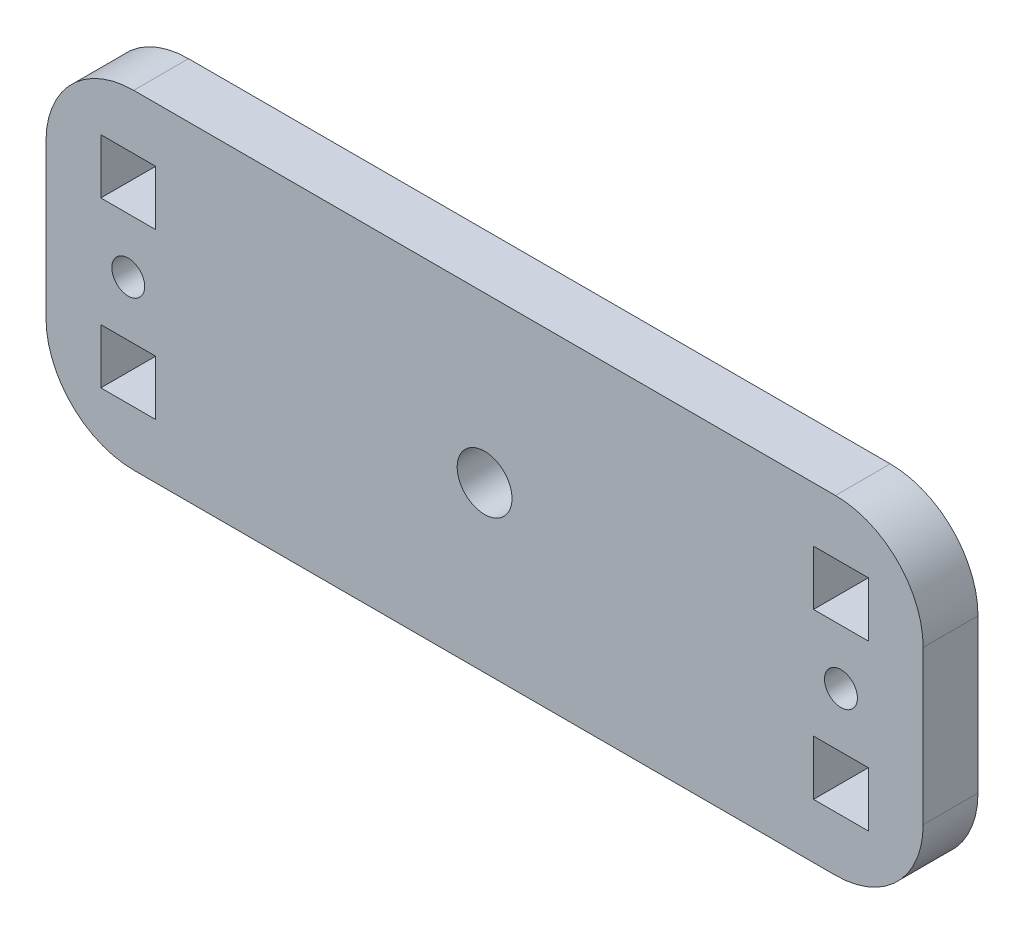
ISO-10303-21;
HEADER;
FILE_DESCRIPTION(('STEP AP214'),'2;1');
FILE_NAME('part.step','',(''),(''),'','','');
FILE_SCHEMA(('AUTOMOTIVE_DESIGN { 1 0 10303 214 1 1 1 1 }'));
ENDSEC;
DATA;
#1=APPLICATION_CONTEXT('core data for automotive mechanical design processes');
#2=APPLICATION_PROTOCOL_DEFINITION('international standard','automotive_design',2000,#1);
#3=PRODUCT_CONTEXT('',#1,'mechanical');
#4=PRODUCT('Part','Part','',(#3));
#5=PRODUCT_RELATED_PRODUCT_CATEGORY('part','',(#4));
#6=PRODUCT_DEFINITION_FORMATION('','',#4);
#7=PRODUCT_DEFINITION_CONTEXT('part definition',#1,'design');
#8=PRODUCT_DEFINITION('design','',#6,#7);
#9=PRODUCT_DEFINITION_SHAPE('','',#8);
#10=(LENGTH_UNIT() NAMED_UNIT(*) SI_UNIT(.MILLI.,.METRE.));
#11=(NAMED_UNIT(*) PLANE_ANGLE_UNIT() SI_UNIT($,.RADIAN.));
#12=(NAMED_UNIT(*) SI_UNIT($,.STERADIAN.) SOLID_ANGLE_UNIT());
#13=UNCERTAINTY_MEASURE_WITH_UNIT(LENGTH_MEASURE(1.E-05),#10,'distance_accuracy_value','');
#14=(GEOMETRIC_REPRESENTATION_CONTEXT(3) GLOBAL_UNCERTAINTY_ASSIGNED_CONTEXT((#13)) GLOBAL_UNIT_ASSIGNED_CONTEXT((#10,
#11,#12)) REPRESENTATION_CONTEXT('',''));
#15=CARTESIAN_POINT('',(0.,0.,0.));
#16=DIRECTION('',(0.,0.,1.));
#17=DIRECTION('',(1.,0.,0.));
#18=AXIS2_PLACEMENT_3D('',#15,#16,#17);
#19=CARTESIAN_POINT('',(8.,8.,5.));
#20=DIRECTION('',(0.,0.,-1.));
#21=DIRECTION('',(-1.,0.,0.));
#22=AXIS2_PLACEMENT_3D('',#19,#20,#21);
#23=PLANE('',#22);
#24=DIRECTION('',(1.,0.,0.));
#25=VECTOR('',#24,1.);
#26=CARTESIAN_POINT('',(70.,4.99999999999998,5.));
#27=LINE('',#26,#25);
#28=CARTESIAN_POINT('',(70.,4.99999999999998,5.));
#29=VERTEX_POINT('',#28);
#30=CARTESIAN_POINT('',(75.,4.99999999999998,5.));
#31=VERTEX_POINT('',#30);
#32=EDGE_CURVE('E233',#29,#31,#27,.T.);
#33=ORIENTED_EDGE('',*,*,#32,.F.);
#34=DIRECTION('',(0.,-1.,0.));
#35=VECTOR('',#34,1.);
#36=CARTESIAN_POINT('',(70.,4.99999999999998,5.));
#37=LINE('',#36,#35);
#38=CARTESIAN_POINT('',(70.,10.,5.));
#39=VERTEX_POINT('',#38);
#40=EDGE_CURVE('E241',#39,#29,#37,.T.);
#41=ORIENTED_EDGE('',*,*,#40,.F.);
#42=DIRECTION('',(-1.,0.,0.));
#43=VECTOR('',#42,1.);
#44=CARTESIAN_POINT('',(70.,10.,5.));
#45=LINE('',#44,#43);
#46=CARTESIAN_POINT('',(75.,10.,5.));
#47=VERTEX_POINT('',#46);
#48=EDGE_CURVE('E238',#47,#39,#45,.T.);
#49=ORIENTED_EDGE('',*,*,#48,.F.);
#50=DIRECTION('',(0.,1.,0.));
#51=VECTOR('',#50,1.);
#52=CARTESIAN_POINT('',(75.,4.99999999999998,5.));
#53=LINE('',#52,#51);
#54=EDGE_CURVE('E235',#31,#47,#53,.T.);
#55=ORIENTED_EDGE('',*,*,#54,.F.);
#56=EDGE_LOOP('',(#33,#41,#49,#55));
#57=FACE_BOUND('',#56,.T.);
#58=CARTESIAN_POINT('',(7.5,15.,5.));
#59=DIRECTION('',(0.,0.,1.));
#60=DIRECTION('',(1.,0.,0.));
#61=AXIS2_PLACEMENT_3D('',#58,#59,#60);
#62=CIRCLE('',#61,1.5);
#63=CARTESIAN_POINT('',(9.,15.,5.));
#64=VERTEX_POINT('',#63);
#65=EDGE_CURVE('E301',#64,#64,#62,.T.);
#66=ORIENTED_EDGE('',*,*,#65,.F.);
#67=EDGE_LOOP('',(#66));
#68=FACE_BOUND('',#67,.T.);
#69=DIRECTION('',(0.,-1.,0.));
#70=VECTOR('',#69,1.);
#71=CARTESIAN_POINT('',(5.,25.,5.));
#72=LINE('',#71,#70);
#73=CARTESIAN_POINT('',(5.,25.,5.));
#74=VERTEX_POINT('',#73);
#75=CARTESIAN_POINT('',(5.,20.,5.));
#76=VERTEX_POINT('',#75);
#77=EDGE_CURVE('E307',#74,#76,#72,.T.);
#78=ORIENTED_EDGE('',*,*,#77,.F.);
#79=DIRECTION('',(-1.,0.,0.));
#80=VECTOR('',#79,1.);
#81=CARTESIAN_POINT('',(5.,25.,5.));
#82=LINE('',#81,#80);
#83=CARTESIAN_POINT('',(10.,25.,5.));
#84=VERTEX_POINT('',#83);
#85=EDGE_CURVE('E315',#84,#74,#82,.T.);
#86=ORIENTED_EDGE('',*,*,#85,.F.);
#87=DIRECTION('',(0.,1.,0.));
#88=VECTOR('',#87,1.);
#89=CARTESIAN_POINT('',(10.,25.,5.));
#90=LINE('',#89,#88);
#91=CARTESIAN_POINT('',(10.,20.,5.));
#92=VERTEX_POINT('',#91);
#93=EDGE_CURVE('E312',#92,#84,#90,.T.);
#94=ORIENTED_EDGE('',*,*,#93,.F.);
#95=DIRECTION('',(1.,0.,0.));
#96=VECTOR('',#95,1.);
#97=CARTESIAN_POINT('',(5.,20.,5.));
#98=LINE('',#97,#96);
#99=EDGE_CURVE('E309',#76,#92,#98,.T.);
#100=ORIENTED_EDGE('',*,*,#99,.F.);
#101=EDGE_LOOP('',(#78,#86,#94,#100));
#102=FACE_BOUND('',#101,.T.);
#103=CARTESIAN_POINT('',(8.,8.,5.));
#104=DIRECTION('',(0.,0.,1.));
#105=DIRECTION('',(-1.,0.,0.));
#106=AXIS2_PLACEMENT_3D('',#103,#104,#105);
#107=CIRCLE('',#106,8.);
#108=CARTESIAN_POINT('',(0.,8.00000000000006,5.));
#109=VERTEX_POINT('',#108);
#110=CARTESIAN_POINT('',(8.00000000000006,0.,5.));
#111=VERTEX_POINT('',#110);
#112=EDGE_CURVE('E338',#109,#111,#107,.T.);
#113=ORIENTED_EDGE('',*,*,#112,.T.);
#114=DIRECTION('',(1.,0.,0.));
#115=VECTOR('',#114,1.);
#116=CARTESIAN_POINT('',(8.00000000000006,0.,5.));
#117=LINE('',#116,#115);
#118=CARTESIAN_POINT('',(72.,0.,5.));
#119=VERTEX_POINT('',#118);
#120=EDGE_CURVE('E341',#111,#119,#117,.T.);
#121=ORIENTED_EDGE('',*,*,#120,.T.);
#122=CARTESIAN_POINT('',(72.,7.99999999999999,5.));
#123=DIRECTION('',(0.,0.,1.));
#124=DIRECTION('',(1.,0.,0.));
#125=AXIS2_PLACEMENT_3D('',#122,#123,#124);
#126=CIRCLE('',#125,8.);
#127=CARTESIAN_POINT('',(80.,7.99999999999999,5.));
#128=VERTEX_POINT('',#127);
#129=EDGE_CURVE('E344',#119,#128,#126,.T.);
#130=ORIENTED_EDGE('',*,*,#129,.T.);
#131=DIRECTION('',(0.,1.,0.));
#132=VECTOR('',#131,1.);
#133=CARTESIAN_POINT('',(80.,7.99999999999999,5.));
#134=LINE('',#133,#132);
#135=CARTESIAN_POINT('',(80.,22.,5.));
#136=VERTEX_POINT('',#135);
#137=EDGE_CURVE('E346',#128,#136,#134,.T.);
#138=ORIENTED_EDGE('',*,*,#137,.T.);
#139=CARTESIAN_POINT('',(72.,22.,5.));
#140=DIRECTION('',(0.,0.,1.));
#141=DIRECTION('',(-1.,0.,0.));
#142=AXIS2_PLACEMENT_3D('',#139,#140,#141);
#143=CIRCLE('',#142,8.);
#144=CARTESIAN_POINT('',(72.,30.,5.));
#145=VERTEX_POINT('',#144);
#146=EDGE_CURVE('E348',#136,#145,#143,.T.);
#147=ORIENTED_EDGE('',*,*,#146,.T.);
#148=DIRECTION('',(-1.,0.,0.));
#149=VECTOR('',#148,1.);
#150=CARTESIAN_POINT('',(8.,30.,5.));
#151=LINE('',#150,#149);
#152=CARTESIAN_POINT('',(8.,30.,5.));
#153=VERTEX_POINT('',#152);
#154=EDGE_CURVE('E350',#145,#153,#151,.T.);
#155=ORIENTED_EDGE('',*,*,#154,.T.);
#156=CARTESIAN_POINT('',(8.,22.,5.));
#157=DIRECTION('',(0.,0.,1.));
#158=DIRECTION('',(-1.,0.,0.));
#159=AXIS2_PLACEMENT_3D('',#156,#157,#158);
#160=CIRCLE('',#159,8.);
#161=CARTESIAN_POINT('',(0.,22.,5.));
#162=VERTEX_POINT('',#161);
#163=EDGE_CURVE('E352',#153,#162,#160,.T.);
#164=ORIENTED_EDGE('',*,*,#163,.T.);
#165=DIRECTION('',(0.,-1.,0.));
#166=VECTOR('',#165,1.);
#167=CARTESIAN_POINT('',(0.,8.00000000000006,5.));
#168=LINE('',#167,#166);
#169=EDGE_CURVE('E354',#162,#109,#168,.T.);
#170=ORIENTED_EDGE('',*,*,#169,.T.);
#171=EDGE_LOOP('',(#113,#121,#130,#138,#147,#155,#164,#170));
#172=FACE_BOUND('',#171,.T.);
#173=DIRECTION('',(0.,-1.,0.));
#174=VECTOR('',#173,1.);
#175=CARTESIAN_POINT('',(70.,25.,5.));
#176=LINE('',#175,#174);
#177=CARTESIAN_POINT('',(70.,25.,5.));
#178=VERTEX_POINT('',#177);
#179=CARTESIAN_POINT('',(70.,20.,5.));
#180=VERTEX_POINT('',#179);
#181=EDGE_CURVE('E270',#178,#180,#176,.T.);
#182=ORIENTED_EDGE('',*,*,#181,.F.);
#183=DIRECTION('',(-1.,0.,0.));
#184=VECTOR('',#183,1.);
#185=CARTESIAN_POINT('',(70.,25.,5.));
#186=LINE('',#185,#184);
#187=CARTESIAN_POINT('',(75.,25.,5.));
#188=VERTEX_POINT('',#187);
#189=EDGE_CURVE('E278',#188,#178,#186,.T.);
#190=ORIENTED_EDGE('',*,*,#189,.F.);
#191=DIRECTION('',(0.,1.,0.));
#192=VECTOR('',#191,1.);
#193=CARTESIAN_POINT('',(75.,25.,5.));
#194=LINE('',#193,#192);
#195=CARTESIAN_POINT('',(75.,20.,5.));
#196=VERTEX_POINT('',#195);
#197=EDGE_CURVE('E275',#196,#188,#194,.T.);
#198=ORIENTED_EDGE('',*,*,#197,.F.);
#199=DIRECTION('',(1.,0.,0.));
#200=VECTOR('',#199,1.);
#201=CARTESIAN_POINT('',(70.,20.,5.));
#202=LINE('',#201,#200);
#203=EDGE_CURVE('E272',#180,#196,#202,.T.);
#204=ORIENTED_EDGE('',*,*,#203,.F.);
#205=EDGE_LOOP('',(#182,#190,#198,#204));
#206=FACE_BOUND('',#205,.T.);
#207=CARTESIAN_POINT('',(72.5,15.,5.));
#208=DIRECTION('',(0.,0.,1.));
#209=DIRECTION('',(1.,0.,0.));
#210=AXIS2_PLACEMENT_3D('',#207,#208,#209);
#211=CIRCLE('',#210,1.5);
#212=CARTESIAN_POINT('',(74.,15.,5.));
#213=VERTEX_POINT('',#212);
#214=EDGE_CURVE('E264',#213,#213,#211,.T.);
#215=ORIENTED_EDGE('',*,*,#214,.F.);
#216=EDGE_LOOP('',(#215));
#217=FACE_BOUND('',#216,.T.);
#218=DIRECTION('',(1.,0.,0.));
#219=VECTOR('',#218,1.);
#220=CARTESIAN_POINT('',(5.,4.99999999999999,5.));
#221=LINE('',#220,#219);
#222=CARTESIAN_POINT('',(5.,4.99999999999999,5.));
#223=VERTEX_POINT('',#222);
#224=CARTESIAN_POINT('',(10.,4.99999999999999,5.));
#225=VERTEX_POINT('',#224);
#226=EDGE_CURVE('E194',#223,#225,#221,.T.);
#227=ORIENTED_EDGE('',*,*,#226,.F.);
#228=DIRECTION('',(0.,-1.,0.));
#229=VECTOR('',#228,1.);
#230=CARTESIAN_POINT('',(5.,4.99999999999999,5.));
#231=LINE('',#230,#229);
#232=CARTESIAN_POINT('',(4.99999999999999,9.99999999999999,5.));
#233=VERTEX_POINT('',#232);
#234=EDGE_CURVE('E217',#233,#223,#231,.T.);
#235=ORIENTED_EDGE('',*,*,#234,.F.);
#236=DIRECTION('',(-1.,0.,0.));
#237=VECTOR('',#236,1.);
#238=CARTESIAN_POINT('',(4.99999999999999,9.99999999999999,5.));
#239=LINE('',#238,#237);
#240=CARTESIAN_POINT('',(9.99999999999999,9.99999999999999,5.));
#241=VERTEX_POINT('',#240);
#242=EDGE_CURVE('E215',#241,#233,#239,.T.);
#243=ORIENTED_EDGE('',*,*,#242,.F.);
#244=DIRECTION('',(0.,1.,0.));
#245=VECTOR('',#244,1.);
#246=CARTESIAN_POINT('',(10.,4.99999999999999,5.));
#247=LINE('',#246,#245);
#248=EDGE_CURVE('E202',#225,#241,#247,.T.);
#249=ORIENTED_EDGE('',*,*,#248,.F.);
#250=EDGE_LOOP('',(#227,#235,#243,#249));
#251=FACE_BOUND('',#250,.T.);
#252=CARTESIAN_POINT('',(40.,15.,5.));
#253=DIRECTION('',(0.,0.,1.));
#254=DIRECTION('',(1.,0.,0.));
#255=AXIS2_PLACEMENT_3D('',#252,#253,#254);
#256=CIRCLE('',#255,2.49999999999999);
#257=CARTESIAN_POINT('',(42.5,15.,5.));
#258=VERTEX_POINT('',#257);
#259=EDGE_CURVE('E223',#258,#258,#256,.T.);
#260=ORIENTED_EDGE('',*,*,#259,.F.);
#261=EDGE_LOOP('',(#260));
#262=FACE_BOUND('',#261,.T.);
#263=ADVANCED_FACE('F33',(#57,#68,#102,#172,#206,#217,#251,#262),#23,.F.);
#264=CARTESIAN_POINT('',(8.,8.,0.));
#265=DIRECTION('',(0.,0.,-1.));
#266=DIRECTION('',(-1.,0.,0.));
#267=AXIS2_PLACEMENT_3D('',#264,#265,#266);
#268=PLANE('',#267);
#269=DIRECTION('',(0.,-1.,0.));
#270=VECTOR('',#269,1.);
#271=CARTESIAN_POINT('',(5.,4.99999999999999,0.));
#272=LINE('',#271,#270);
#273=CARTESIAN_POINT('',(4.99999999999999,9.99999999999999,0.));
#274=VERTEX_POINT('',#273);
#275=CARTESIAN_POINT('',(5.,4.99999999999999,0.));
#276=VERTEX_POINT('',#275);
#277=EDGE_CURVE('E203',#274,#276,#272,.T.);
#278=ORIENTED_EDGE('',*,*,#277,.T.);
#279=DIRECTION('',(1.,0.,0.));
#280=VECTOR('',#279,1.);
#281=CARTESIAN_POINT('',(5.,4.99999999999999,0.));
#282=LINE('',#281,#280);
#283=CARTESIAN_POINT('',(10.,4.99999999999999,0.));
#284=VERTEX_POINT('',#283);
#285=EDGE_CURVE('E56',#276,#284,#282,.T.);
#286=ORIENTED_EDGE('',*,*,#285,.T.);
#287=DIRECTION('',(0.,1.,0.));
#288=VECTOR('',#287,1.);
#289=CARTESIAN_POINT('',(10.,4.99999999999999,0.));
#290=LINE('',#289,#288);
#291=CARTESIAN_POINT('',(9.99999999999999,9.99999999999999,0.));
#292=VERTEX_POINT('',#291);
#293=EDGE_CURVE('E209',#284,#292,#290,.T.);
#294=ORIENTED_EDGE('',*,*,#293,.T.);
#295=DIRECTION('',(-1.,0.,0.));
#296=VECTOR('',#295,1.);
#297=CARTESIAN_POINT('',(4.99999999999999,9.99999999999999,0.));
#298=LINE('',#297,#296);
#299=EDGE_CURVE('E225',#292,#274,#298,.T.);
#300=ORIENTED_EDGE('',*,*,#299,.T.);
#301=EDGE_LOOP('',(#278,#286,#294,#300));
#302=FACE_BOUND('',#301,.T.);
#303=DIRECTION('',(0.,-1.,0.));
#304=VECTOR('',#303,1.);
#305=CARTESIAN_POINT('',(70.,4.99999999999998,0.));
#306=LINE('',#305,#304);
#307=CARTESIAN_POINT('',(70.,10.,0.));
#308=VERTEX_POINT('',#307);
#309=CARTESIAN_POINT('',(70.,4.99999999999998,0.));
#310=VERTEX_POINT('',#309);
#311=EDGE_CURVE('E236',#308,#310,#306,.T.);
#312=ORIENTED_EDGE('',*,*,#311,.T.);
#313=DIRECTION('',(1.,0.,0.));
#314=VECTOR('',#313,1.);
#315=CARTESIAN_POINT('',(70.,4.99999999999998,0.));
#316=LINE('',#315,#314);
#317=CARTESIAN_POINT('',(75.,4.99999999999998,0.));
#318=VERTEX_POINT('',#317);
#319=EDGE_CURVE('E210',#310,#318,#316,.T.);
#320=ORIENTED_EDGE('',*,*,#319,.T.);
#321=DIRECTION('',(0.,1.,0.));
#322=VECTOR('',#321,1.);
#323=CARTESIAN_POINT('',(75.,4.99999999999998,0.));
#324=LINE('',#323,#322);
#325=CARTESIAN_POINT('',(75.,10.,0.));
#326=VERTEX_POINT('',#325);
#327=EDGE_CURVE('E246',#318,#326,#324,.T.);
#328=ORIENTED_EDGE('',*,*,#327,.T.);
#329=DIRECTION('',(-1.,0.,0.));
#330=VECTOR('',#329,1.);
#331=CARTESIAN_POINT('',(70.,10.,0.));
#332=LINE('',#331,#330);
#333=EDGE_CURVE('E249',#326,#308,#332,.T.);
#334=ORIENTED_EDGE('',*,*,#333,.T.);
#335=EDGE_LOOP('',(#312,#320,#328,#334));
#336=FACE_BOUND('',#335,.T.);
#337=CARTESIAN_POINT('',(72.5,15.,0.));
#338=DIRECTION('',(0.,0.,1.));
#339=DIRECTION('',(1.,0.,0.));
#340=AXIS2_PLACEMENT_3D('',#337,#338,#339);
#341=CIRCLE('',#340,1.5);
#342=CARTESIAN_POINT('',(74.,15.,0.));
#343=VERTEX_POINT('',#342);
#344=EDGE_CURVE('E263',#343,#343,#341,.T.);
#345=ORIENTED_EDGE('',*,*,#344,.T.);
#346=EDGE_LOOP('',(#345));
#347=FACE_BOUND('',#346,.T.);
#348=DIRECTION('',(-1.,0.,0.));
#349=VECTOR('',#348,1.);
#350=CARTESIAN_POINT('',(5.,25.,0.));
#351=LINE('',#350,#349);
#352=CARTESIAN_POINT('',(10.,25.,0.));
#353=VERTEX_POINT('',#352);
#354=CARTESIAN_POINT('',(5.,25.,0.));
#355=VERTEX_POINT('',#354);
#356=EDGE_CURVE('E310',#353,#355,#351,.T.);
#357=ORIENTED_EDGE('',*,*,#356,.T.);
#358=DIRECTION('',(0.,-1.,0.));
#359=VECTOR('',#358,1.);
#360=CARTESIAN_POINT('',(5.,25.,0.));
#361=LINE('',#360,#359);
#362=CARTESIAN_POINT('',(5.,20.,0.));
#363=VERTEX_POINT('',#362);
#364=EDGE_CURVE('E304',#355,#363,#361,.T.);
#365=ORIENTED_EDGE('',*,*,#364,.T.);
#366=DIRECTION('',(1.,0.,0.));
#367=VECTOR('',#366,1.);
#368=CARTESIAN_POINT('',(5.,20.,0.));
#369=LINE('',#368,#367);
#370=CARTESIAN_POINT('',(10.,20.,0.));
#371=VERTEX_POINT('',#370);
#372=EDGE_CURVE('E320',#363,#371,#369,.T.);
#373=ORIENTED_EDGE('',*,*,#372,.T.);
#374=DIRECTION('',(0.,1.,0.));
#375=VECTOR('',#374,1.);
#376=CARTESIAN_POINT('',(10.,25.,0.));
#377=LINE('',#376,#375);
#378=EDGE_CURVE('E323',#371,#353,#377,.T.);
#379=ORIENTED_EDGE('',*,*,#378,.T.);
#380=EDGE_LOOP('',(#357,#365,#373,#379));
#381=FACE_BOUND('',#380,.T.);
#382=CARTESIAN_POINT('',(8.,8.,0.));
#383=DIRECTION('',(0.,0.,1.));
#384=DIRECTION('',(-1.,0.,0.));
#385=AXIS2_PLACEMENT_3D('',#382,#383,#384);
#386=CIRCLE('',#385,8.);
#387=CARTESIAN_POINT('',(0.,8.00000000000006,0.));
#388=VERTEX_POINT('',#387);
#389=CARTESIAN_POINT('',(8.00000000000006,0.,0.));
#390=VERTEX_POINT('',#389);
#391=EDGE_CURVE('E337',#388,#390,#386,.T.);
#392=ORIENTED_EDGE('',*,*,#391,.F.);
#393=DIRECTION('',(0.,-1.,0.));
#394=VECTOR('',#393,1.);
#395=CARTESIAN_POINT('',(0.,8.00000000000006,0.));
#396=LINE('',#395,#394);
#397=CARTESIAN_POINT('',(0.,22.,0.));
#398=VERTEX_POINT('',#397);
#399=EDGE_CURVE('E342',#398,#388,#396,.T.);
#400=ORIENTED_EDGE('',*,*,#399,.F.);
#401=CARTESIAN_POINT('',(8.,22.,0.));
#402=DIRECTION('',(0.,0.,1.));
#403=DIRECTION('',(-1.,0.,0.));
#404=AXIS2_PLACEMENT_3D('',#401,#402,#403);
#405=CIRCLE('',#404,8.);
#406=CARTESIAN_POINT('',(8.,30.,0.));
#407=VERTEX_POINT('',#406);
#408=EDGE_CURVE('E369',#407,#398,#405,.T.);
#409=ORIENTED_EDGE('',*,*,#408,.F.);
#410=DIRECTION('',(-1.,0.,0.));
#411=VECTOR('',#410,1.);
#412=CARTESIAN_POINT('',(8.,30.,0.));
#413=LINE('',#412,#411);
#414=CARTESIAN_POINT('',(72.,30.,0.));
#415=VERTEX_POINT('',#414);
#416=EDGE_CURVE('E367',#415,#407,#413,.T.);
#417=ORIENTED_EDGE('',*,*,#416,.F.);
#418=CARTESIAN_POINT('',(72.,22.,0.));
#419=DIRECTION('',(0.,0.,1.));
#420=DIRECTION('',(-1.,0.,0.));
#421=AXIS2_PLACEMENT_3D('',#418,#419,#420);
#422=CIRCLE('',#421,8.);
#423=CARTESIAN_POINT('',(80.,22.,0.));
#424=VERTEX_POINT('',#423);
#425=EDGE_CURVE('E365',#424,#415,#422,.T.);
#426=ORIENTED_EDGE('',*,*,#425,.F.);
#427=DIRECTION('',(0.,1.,0.));
#428=VECTOR('',#427,1.);
#429=CARTESIAN_POINT('',(80.,7.99999999999999,0.));
#430=LINE('',#429,#428);
#431=CARTESIAN_POINT('',(80.,7.99999999999999,0.));
#432=VERTEX_POINT('',#431);
#433=EDGE_CURVE('E363',#432,#424,#430,.T.);
#434=ORIENTED_EDGE('',*,*,#433,.F.);
#435=CARTESIAN_POINT('',(72.,7.99999999999999,0.));
#436=DIRECTION('',(0.,0.,1.));
#437=DIRECTION('',(1.,0.,0.));
#438=AXIS2_PLACEMENT_3D('',#435,#436,#437);
#439=CIRCLE('',#438,8.);
#440=CARTESIAN_POINT('',(72.,0.,0.));
#441=VERTEX_POINT('',#440);
#442=EDGE_CURVE('E361',#441,#432,#439,.T.);
#443=ORIENTED_EDGE('',*,*,#442,.F.);
#444=DIRECTION('',(1.,0.,0.));
#445=VECTOR('',#444,1.);
#446=CARTESIAN_POINT('',(8.00000000000006,0.,0.));
#447=LINE('',#446,#445);
#448=EDGE_CURVE('E359',#390,#441,#447,.T.);
#449=ORIENTED_EDGE('',*,*,#448,.F.);
#450=EDGE_LOOP('',(#392,#400,#409,#417,#426,#434,#443,#449));
#451=FACE_BOUND('',#450,.T.);
#452=CARTESIAN_POINT('',(7.5,15.,0.));
#453=DIRECTION('',(0.,0.,1.));
#454=DIRECTION('',(1.,0.,0.));
#455=AXIS2_PLACEMENT_3D('',#452,#453,#454);
#456=CIRCLE('',#455,1.5);
#457=CARTESIAN_POINT('',(9.,15.,0.));
#458=VERTEX_POINT('',#457);
#459=EDGE_CURVE('E300',#458,#458,#456,.T.);
#460=ORIENTED_EDGE('',*,*,#459,.T.);
#461=EDGE_LOOP('',(#460));
#462=FACE_BOUND('',#461,.T.);
#463=DIRECTION('',(-1.,0.,0.));
#464=VECTOR('',#463,1.);
#465=CARTESIAN_POINT('',(70.,25.,0.));
#466=LINE('',#465,#464);
#467=CARTESIAN_POINT('',(75.,25.,0.));
#468=VERTEX_POINT('',#467);
#469=CARTESIAN_POINT('',(70.,25.,0.));
#470=VERTEX_POINT('',#469);
#471=EDGE_CURVE('E273',#468,#470,#466,.T.);
#472=ORIENTED_EDGE('',*,*,#471,.T.);
#473=DIRECTION('',(0.,-1.,0.));
#474=VECTOR('',#473,1.);
#475=CARTESIAN_POINT('',(70.,25.,0.));
#476=LINE('',#475,#474);
#477=CARTESIAN_POINT('',(70.,20.,0.));
#478=VERTEX_POINT('',#477);
#479=EDGE_CURVE('E267',#470,#478,#476,.T.);
#480=ORIENTED_EDGE('',*,*,#479,.T.);
#481=DIRECTION('',(1.,0.,0.));
#482=VECTOR('',#481,1.);
#483=CARTESIAN_POINT('',(70.,20.,0.));
#484=LINE('',#483,#482);
#485=CARTESIAN_POINT('',(75.,20.,0.));
#486=VERTEX_POINT('',#485);
#487=EDGE_CURVE('E283',#478,#486,#484,.T.);
#488=ORIENTED_EDGE('',*,*,#487,.T.);
#489=DIRECTION('',(0.,1.,0.));
#490=VECTOR('',#489,1.);
#491=CARTESIAN_POINT('',(75.,25.,0.));
#492=LINE('',#491,#490);
#493=EDGE_CURVE('E286',#486,#468,#492,.T.);
#494=ORIENTED_EDGE('',*,*,#493,.T.);
#495=EDGE_LOOP('',(#472,#480,#488,#494));
#496=FACE_BOUND('',#495,.T.);
#497=CARTESIAN_POINT('',(40.,15.,0.));
#498=DIRECTION('',(0.,0.,1.));
#499=DIRECTION('',(1.,0.,0.));
#500=AXIS2_PLACEMENT_3D('',#497,#498,#499);
#501=CIRCLE('',#500,2.49999999999999);
#502=CARTESIAN_POINT('',(42.5,15.,0.));
#503=VERTEX_POINT('',#502);
#504=EDGE_CURVE('E546',#503,#503,#501,.T.);
#505=ORIENTED_EDGE('',*,*,#504,.T.);
#506=EDGE_LOOP('',(#505));
#507=FACE_BOUND('',#506,.T.);
#508=ADVANCED_FACE('F399',(#302,#336,#347,#381,#451,#462,#496,#507),#268,.T.);
#509=CARTESIAN_POINT('',(8.,8.,5.));
#510=DIRECTION('',(0.,0.,-1.));
#511=DIRECTION('',(-1.,0.,0.));
#512=AXIS2_PLACEMENT_3D('',#509,#510,#511);
#513=CYLINDRICAL_SURFACE('',#512,8.);
#514=ORIENTED_EDGE('',*,*,#391,.T.);
#515=DIRECTION('',(0.,0.,-1.));
#516=VECTOR('',#515,1.);
#517=CARTESIAN_POINT('',(8.00000000000006,0.,5.));
#518=LINE('',#517,#516);
#519=EDGE_CURVE('E11',#111,#390,#518,.T.);
#520=ORIENTED_EDGE('',*,*,#519,.F.);
#521=ORIENTED_EDGE('',*,*,#112,.F.);
#522=DIRECTION('',(0.,0.,-1.));
#523=VECTOR('',#522,1.);
#524=CARTESIAN_POINT('',(0.,8.00000000000006,5.));
#525=LINE('',#524,#523);
#526=EDGE_CURVE('E356',#109,#388,#525,.T.);
#527=ORIENTED_EDGE('',*,*,#526,.T.);
#528=EDGE_LOOP('',(#514,#520,#521,#527));
#529=FACE_BOUND('',#528,.T.);
#530=ADVANCED_FACE('F35',(#529),#513,.T.);
#531=CARTESIAN_POINT('',(8.00000000000006,0.,5.));
#532=DIRECTION('',(0.,1.,0.));
#533=DIRECTION('',(-1.,0.,0.));
#534=AXIS2_PLACEMENT_3D('',#531,#532,#533);
#535=PLANE('',#534);
#536=ORIENTED_EDGE('',*,*,#448,.T.);
#537=DIRECTION('',(0.,0.,-1.));
#538=VECTOR('',#537,1.);
#539=CARTESIAN_POINT('',(72.,0.,5.));
#540=LINE('',#539,#538);
#541=EDGE_CURVE('E41',#119,#441,#540,.T.);
#542=ORIENTED_EDGE('',*,*,#541,.F.);
#543=ORIENTED_EDGE('',*,*,#120,.F.);
#544=ORIENTED_EDGE('',*,*,#519,.T.);
#545=EDGE_LOOP('',(#536,#542,#543,#544));
#546=FACE_BOUND('',#545,.T.);
#547=ADVANCED_FACE('F417',(#546),#535,.F.);
#548=CARTESIAN_POINT('',(72.,7.99999999999999,5.));
#549=DIRECTION('',(0.,0.,-1.));
#550=DIRECTION('',(-1.,0.,0.));
#551=AXIS2_PLACEMENT_3D('',#548,#549,#550);
#552=CYLINDRICAL_SURFACE('',#551,8.);
#553=ORIENTED_EDGE('',*,*,#442,.T.);
#554=DIRECTION('',(0.,0.,-1.));
#555=VECTOR('',#554,1.);
#556=CARTESIAN_POINT('',(80.,7.99999999999999,5.));
#557=LINE('',#556,#555);
#558=EDGE_CURVE('E386',#128,#432,#557,.T.);
#559=ORIENTED_EDGE('',*,*,#558,.F.);
#560=ORIENTED_EDGE('',*,*,#129,.F.);
#561=ORIENTED_EDGE('',*,*,#541,.T.);
#562=EDGE_LOOP('',(#553,#559,#560,#561));
#563=FACE_BOUND('',#562,.T.);
#564=ADVANCED_FACE('F393',(#563),#552,.T.);
#565=CARTESIAN_POINT('',(80.,7.99999999999999,5.));
#566=DIRECTION('',(-1.,0.,0.));
#567=DIRECTION('',(0.,0.,1.));
#568=AXIS2_PLACEMENT_3D('',#565,#566,#567);
#569=PLANE('',#568);
#570=ORIENTED_EDGE('',*,*,#433,.T.);
#571=DIRECTION('',(0.,0.,-1.));
#572=VECTOR('',#571,1.);
#573=CARTESIAN_POINT('',(80.,22.,5.));
#574=LINE('',#573,#572);
#575=EDGE_CURVE('E383',#136,#424,#574,.T.);
#576=ORIENTED_EDGE('',*,*,#575,.F.);
#577=ORIENTED_EDGE('',*,*,#137,.F.);
#578=ORIENTED_EDGE('',*,*,#558,.T.);
#579=EDGE_LOOP('',(#570,#576,#577,#578));
#580=FACE_BOUND('',#579,.T.);
#581=ADVANCED_FACE('F405',(#580),#569,.F.);
#582=CARTESIAN_POINT('',(72.,22.,5.));
#583=DIRECTION('',(0.,0.,-1.));
#584=DIRECTION('',(-1.,0.,0.));
#585=AXIS2_PLACEMENT_3D('',#582,#583,#584);
#586=CYLINDRICAL_SURFACE('',#585,8.);
#587=ORIENTED_EDGE('',*,*,#425,.T.);
#588=DIRECTION('',(0.,0.,-1.));
#589=VECTOR('',#588,1.);
#590=CARTESIAN_POINT('',(72.,30.,5.));
#591=LINE('',#590,#589);
#592=EDGE_CURVE('E380',#145,#415,#591,.T.);
#593=ORIENTED_EDGE('',*,*,#592,.F.);
#594=ORIENTED_EDGE('',*,*,#146,.F.);
#595=ORIENTED_EDGE('',*,*,#575,.T.);
#596=EDGE_LOOP('',(#587,#593,#594,#595));
#597=FACE_BOUND('',#596,.T.);
#598=ADVANCED_FACE('F409',(#597),#586,.T.);
#599=CARTESIAN_POINT('',(8.,30.,5.));
#600=DIRECTION('',(0.,-1.,0.));
#601=DIRECTION('',(1.,0.,0.));
#602=AXIS2_PLACEMENT_3D('',#599,#600,#601);
#603=PLANE('',#602);
#604=ORIENTED_EDGE('',*,*,#416,.T.);
#605=DIRECTION('',(0.,0.,-1.));
#606=VECTOR('',#605,1.);
#607=CARTESIAN_POINT('',(8.,30.,5.));
#608=LINE('',#607,#606);
#609=EDGE_CURVE('E377',#153,#407,#608,.T.);
#610=ORIENTED_EDGE('',*,*,#609,.F.);
#611=ORIENTED_EDGE('',*,*,#154,.F.);
#612=ORIENTED_EDGE('',*,*,#592,.T.);
#613=EDGE_LOOP('',(#604,#610,#611,#612));
#614=FACE_BOUND('',#613,.T.);
#615=ADVANCED_FACE('F430',(#614),#603,.F.);
#616=CARTESIAN_POINT('',(8.,22.,5.));
#617=DIRECTION('',(0.,0.,-1.));
#618=DIRECTION('',(-1.,0.,0.));
#619=AXIS2_PLACEMENT_3D('',#616,#617,#618);
#620=CYLINDRICAL_SURFACE('',#619,8.);
#621=ORIENTED_EDGE('',*,*,#408,.T.);
#622=DIRECTION('',(0.,0.,-1.));
#623=VECTOR('',#622,1.);
#624=CARTESIAN_POINT('',(0.,22.,5.));
#625=LINE('',#624,#623);
#626=EDGE_CURVE('E374',#162,#398,#625,.T.);
#627=ORIENTED_EDGE('',*,*,#626,.F.);
#628=ORIENTED_EDGE('',*,*,#163,.F.);
#629=ORIENTED_EDGE('',*,*,#609,.T.);
#630=EDGE_LOOP('',(#621,#627,#628,#629));
#631=FACE_BOUND('',#630,.T.);
#632=ADVANCED_FACE('F428',(#631),#620,.T.);
#633=CARTESIAN_POINT('',(0.,8.00000000000006,5.));
#634=DIRECTION('',(1.,0.,0.));
#635=DIRECTION('',(0.,1.,0.));
#636=AXIS2_PLACEMENT_3D('',#633,#634,#635);
#637=PLANE('',#636);
#638=ORIENTED_EDGE('',*,*,#399,.T.);
#639=ORIENTED_EDGE('',*,*,#526,.F.);
#640=ORIENTED_EDGE('',*,*,#169,.F.);
#641=ORIENTED_EDGE('',*,*,#626,.T.);
#642=EDGE_LOOP('',(#638,#639,#640,#641));
#643=FACE_BOUND('',#642,.T.);
#644=ADVANCED_FACE('F423',(#643),#637,.F.);
#645=CARTESIAN_POINT('',(5.,25.,5.));
#646=DIRECTION('',(1.,0.,0.));
#647=DIRECTION('',(0.,1.,0.));
#648=AXIS2_PLACEMENT_3D('',#645,#646,#647);
#649=PLANE('',#648);
#650=ORIENTED_EDGE('',*,*,#364,.F.);
#651=DIRECTION('',(0.,0.,-1.));
#652=VECTOR('',#651,1.);
#653=CARTESIAN_POINT('',(5.,25.,5.));
#654=LINE('',#653,#652);
#655=EDGE_CURVE('E317',#74,#355,#654,.T.);
#656=ORIENTED_EDGE('',*,*,#655,.F.);
#657=ORIENTED_EDGE('',*,*,#77,.T.);
#658=DIRECTION('',(0.,0.,-1.));
#659=VECTOR('',#658,1.);
#660=CARTESIAN_POINT('',(5.,20.,5.));
#661=LINE('',#660,#659);
#662=EDGE_CURVE('E334',#76,#363,#661,.T.);
#663=ORIENTED_EDGE('',*,*,#662,.T.);
#664=EDGE_LOOP('',(#650,#656,#657,#663));
#665=FACE_BOUND('',#664,.T.);
#666=ADVANCED_FACE('F450',(#665),#649,.T.);
#667=CARTESIAN_POINT('',(5.,20.,5.));
#668=DIRECTION('',(0.,1.,0.));
#669=DIRECTION('',(-1.,0.,0.));
#670=AXIS2_PLACEMENT_3D('',#667,#668,#669);
#671=PLANE('',#670);
#672=ORIENTED_EDGE('',*,*,#372,.F.);
#673=ORIENTED_EDGE('',*,*,#662,.F.);
#674=ORIENTED_EDGE('',*,*,#99,.T.);
#675=DIRECTION('',(0.,0.,-1.));
#676=VECTOR('',#675,1.);
#677=CARTESIAN_POINT('',(10.,20.,5.));
#678=LINE('',#677,#676);
#679=EDGE_CURVE('E332',#92,#371,#678,.T.);
#680=ORIENTED_EDGE('',*,*,#679,.T.);
#681=EDGE_LOOP('',(#672,#673,#674,#680));
#682=FACE_BOUND('',#681,.T.);
#683=ADVANCED_FACE('F457',(#682),#671,.T.);
#684=CARTESIAN_POINT('',(10.,25.,5.));
#685=DIRECTION('',(-1.,0.,0.));
#686=DIRECTION('',(0.,0.,1.));
#687=AXIS2_PLACEMENT_3D('',#684,#685,#686);
#688=PLANE('',#687);
#689=ORIENTED_EDGE('',*,*,#378,.F.);
#690=ORIENTED_EDGE('',*,*,#679,.F.);
#691=ORIENTED_EDGE('',*,*,#93,.T.);
#692=DIRECTION('',(0.,0.,-1.));
#693=VECTOR('',#692,1.);
#694=CARTESIAN_POINT('',(10.,25.,5.));
#695=LINE('',#694,#693);
#696=EDGE_CURVE('E330',#84,#353,#695,.T.);
#697=ORIENTED_EDGE('',*,*,#696,.T.);
#698=EDGE_LOOP('',(#689,#690,#691,#697));
#699=FACE_BOUND('',#698,.T.);
#700=ADVANCED_FACE('F462',(#699),#688,.T.);
#701=CARTESIAN_POINT('',(5.,25.,5.));
#702=DIRECTION('',(0.,-1.,0.));
#703=DIRECTION('',(1.,0.,0.));
#704=AXIS2_PLACEMENT_3D('',#701,#702,#703);
#705=PLANE('',#704);
#706=ORIENTED_EDGE('',*,*,#356,.F.);
#707=ORIENTED_EDGE('',*,*,#696,.F.);
#708=ORIENTED_EDGE('',*,*,#85,.T.);
#709=ORIENTED_EDGE('',*,*,#655,.T.);
#710=EDGE_LOOP('',(#706,#707,#708,#709));
#711=FACE_BOUND('',#710,.T.);
#712=ADVANCED_FACE('F470',(#711),#705,.T.);
#713=CARTESIAN_POINT('',(7.5,15.,5.));
#714=DIRECTION('',(0.,0.,-1.));
#715=DIRECTION('',(-1.,0.,0.));
#716=AXIS2_PLACEMENT_3D('',#713,#714,#715);
#717=CYLINDRICAL_SURFACE('',#716,1.5);
#718=ORIENTED_EDGE('',*,*,#65,.T.);
#719=EDGE_LOOP('',(#718));
#720=FACE_BOUND('',#719,.T.);
#721=ORIENTED_EDGE('',*,*,#459,.F.);
#722=EDGE_LOOP('',(#721));
#723=FACE_BOUND('',#722,.T.);
#724=ADVANCED_FACE('F483',(#720,#723),#717,.F.);
#725=CARTESIAN_POINT('',(70.,25.,5.));
#726=DIRECTION('',(1.,0.,0.));
#727=DIRECTION('',(0.,0.,-1.));
#728=AXIS2_PLACEMENT_3D('',#725,#726,#727);
#729=PLANE('',#728);
#730=ORIENTED_EDGE('',*,*,#479,.F.);
#731=DIRECTION('',(0.,0.,-1.));
#732=VECTOR('',#731,1.);
#733=CARTESIAN_POINT('',(70.,25.,5.));
#734=LINE('',#733,#732);
#735=EDGE_CURVE('E280',#178,#470,#734,.T.);
#736=ORIENTED_EDGE('',*,*,#735,.F.);
#737=ORIENTED_EDGE('',*,*,#181,.T.);
#738=DIRECTION('',(0.,0.,-1.));
#739=VECTOR('',#738,1.);
#740=CARTESIAN_POINT('',(70.,20.,5.));
#741=LINE('',#740,#739);
#742=EDGE_CURVE('E297',#180,#478,#741,.T.);
#743=ORIENTED_EDGE('',*,*,#742,.T.);
#744=EDGE_LOOP('',(#730,#736,#737,#743));
#745=FACE_BOUND('',#744,.T.);
#746=ADVANCED_FACE('F488',(#745),#729,.T.);
#747=CARTESIAN_POINT('',(70.,20.,5.));
#748=DIRECTION('',(0.,1.,0.));
#749=DIRECTION('',(0.,0.,1.));
#750=AXIS2_PLACEMENT_3D('',#747,#748,#749);
#751=PLANE('',#750);
#752=ORIENTED_EDGE('',*,*,#487,.F.);
#753=ORIENTED_EDGE('',*,*,#742,.F.);
#754=ORIENTED_EDGE('',*,*,#203,.T.);
#755=DIRECTION('',(0.,0.,-1.));
#756=VECTOR('',#755,1.);
#757=CARTESIAN_POINT('',(75.,20.,5.));
#758=LINE('',#757,#756);
#759=EDGE_CURVE('E295',#196,#486,#758,.T.);
#760=ORIENTED_EDGE('',*,*,#759,.T.);
#761=EDGE_LOOP('',(#752,#753,#754,#760));
#762=FACE_BOUND('',#761,.T.);
#763=ADVANCED_FACE('F492',(#762),#751,.T.);
#764=CARTESIAN_POINT('',(75.,25.,5.));
#765=DIRECTION('',(-1.,0.,0.));
#766=DIRECTION('',(0.,-1.,0.));
#767=AXIS2_PLACEMENT_3D('',#764,#765,#766);
#768=PLANE('',#767);
#769=ORIENTED_EDGE('',*,*,#493,.F.);
#770=ORIENTED_EDGE('',*,*,#759,.F.);
#771=ORIENTED_EDGE('',*,*,#197,.T.);
#772=DIRECTION('',(0.,0.,-1.));
#773=VECTOR('',#772,1.);
#774=CARTESIAN_POINT('',(75.,25.,5.));
#775=LINE('',#774,#773);
#776=EDGE_CURVE('E293',#188,#468,#775,.T.);
#777=ORIENTED_EDGE('',*,*,#776,.T.);
#778=EDGE_LOOP('',(#769,#770,#771,#777));
#779=FACE_BOUND('',#778,.T.);
#780=ADVANCED_FACE('F496',(#779),#768,.T.);
#781=CARTESIAN_POINT('',(70.,25.,5.));
#782=DIRECTION('',(0.,-1.,0.));
#783=DIRECTION('',(0.,0.,-1.));
#784=AXIS2_PLACEMENT_3D('',#781,#782,#783);
#785=PLANE('',#784);
#786=ORIENTED_EDGE('',*,*,#471,.F.);
#787=ORIENTED_EDGE('',*,*,#776,.F.);
#788=ORIENTED_EDGE('',*,*,#189,.T.);
#789=ORIENTED_EDGE('',*,*,#735,.T.);
#790=EDGE_LOOP('',(#786,#787,#788,#789));
#791=FACE_BOUND('',#790,.T.);
#792=ADVANCED_FACE('F500',(#791),#785,.T.);
#793=CARTESIAN_POINT('',(72.5,15.,5.));
#794=DIRECTION('',(0.,0.,-1.));
#795=DIRECTION('',(-1.,0.,0.));
#796=AXIS2_PLACEMENT_3D('',#793,#794,#795);
#797=CYLINDRICAL_SURFACE('',#796,1.5);
#798=ORIENTED_EDGE('',*,*,#214,.T.);
#799=EDGE_LOOP('',(#798));
#800=FACE_BOUND('',#799,.T.);
#801=ORIENTED_EDGE('',*,*,#344,.F.);
#802=EDGE_LOOP('',(#801));
#803=FACE_BOUND('',#802,.T.);
#804=ADVANCED_FACE('F504',(#800,#803),#797,.F.);
#805=CARTESIAN_POINT('',(70.,4.99999999999998,5.));
#806=DIRECTION('',(0.,1.,0.));
#807=DIRECTION('',(-1.,0.,0.));
#808=AXIS2_PLACEMENT_3D('',#805,#806,#807);
#809=PLANE('',#808);
#810=ORIENTED_EDGE('',*,*,#319,.F.);
#811=DIRECTION('',(0.,0.,-1.));
#812=VECTOR('',#811,1.);
#813=CARTESIAN_POINT('',(70.,4.99999999999998,5.));
#814=LINE('',#813,#812);
#815=EDGE_CURVE('E243',#29,#310,#814,.T.);
#816=ORIENTED_EDGE('',*,*,#815,.F.);
#817=ORIENTED_EDGE('',*,*,#32,.T.);
#818=DIRECTION('',(0.,0.,-1.));
#819=VECTOR('',#818,1.);
#820=CARTESIAN_POINT('',(75.,4.99999999999998,5.));
#821=LINE('',#820,#819);
#822=EDGE_CURVE('E260',#31,#318,#821,.T.);
#823=ORIENTED_EDGE('',*,*,#822,.T.);
#824=EDGE_LOOP('',(#810,#816,#817,#823));
#825=FACE_BOUND('',#824,.T.);
#826=ADVANCED_FACE('F508',(#825),#809,.T.);
#827=CARTESIAN_POINT('',(75.,4.99999999999998,5.));
#828=DIRECTION('',(-1.,0.,0.));
#829=DIRECTION('',(0.,-1.,0.));
#830=AXIS2_PLACEMENT_3D('',#827,#828,#829);
#831=PLANE('',#830);
#832=ORIENTED_EDGE('',*,*,#327,.F.);
#833=ORIENTED_EDGE('',*,*,#822,.F.);
#834=ORIENTED_EDGE('',*,*,#54,.T.);
#835=DIRECTION('',(0.,0.,-1.));
#836=VECTOR('',#835,1.);
#837=CARTESIAN_POINT('',(75.,10.,5.));
#838=LINE('',#837,#836);
#839=EDGE_CURVE('E258',#47,#326,#838,.T.);
#840=ORIENTED_EDGE('',*,*,#839,.T.);
#841=EDGE_LOOP('',(#832,#833,#834,#840));
#842=FACE_BOUND('',#841,.T.);
#843=ADVANCED_FACE('F512',(#842),#831,.T.);
#844=CARTESIAN_POINT('',(70.,10.,5.));
#845=DIRECTION('',(0.,-1.,0.));
#846=DIRECTION('',(0.,0.,-1.));
#847=AXIS2_PLACEMENT_3D('',#844,#845,#846);
#848=PLANE('',#847);
#849=ORIENTED_EDGE('',*,*,#333,.F.);
#850=ORIENTED_EDGE('',*,*,#839,.F.);
#851=ORIENTED_EDGE('',*,*,#48,.T.);
#852=DIRECTION('',(0.,0.,-1.));
#853=VECTOR('',#852,1.);
#854=CARTESIAN_POINT('',(70.,10.,5.));
#855=LINE('',#854,#853);
#856=EDGE_CURVE('E256',#39,#308,#855,.T.);
#857=ORIENTED_EDGE('',*,*,#856,.T.);
#858=EDGE_LOOP('',(#849,#850,#851,#857));
#859=FACE_BOUND('',#858,.T.);
#860=ADVANCED_FACE('F516',(#859),#848,.T.);
#861=CARTESIAN_POINT('',(70.,4.99999999999998,5.));
#862=DIRECTION('',(1.,0.,0.));
#863=DIRECTION('',(0.,1.,0.));
#864=AXIS2_PLACEMENT_3D('',#861,#862,#863);
#865=PLANE('',#864);
#866=ORIENTED_EDGE('',*,*,#311,.F.);
#867=ORIENTED_EDGE('',*,*,#856,.F.);
#868=ORIENTED_EDGE('',*,*,#40,.T.);
#869=ORIENTED_EDGE('',*,*,#815,.T.);
#870=EDGE_LOOP('',(#866,#867,#868,#869));
#871=FACE_BOUND('',#870,.T.);
#872=ADVANCED_FACE('F520',(#871),#865,.T.);
#873=CARTESIAN_POINT('',(5.,4.99999999999999,5.));
#874=DIRECTION('',(0.,1.,0.));
#875=DIRECTION('',(0.,0.,1.));
#876=AXIS2_PLACEMENT_3D('',#873,#874,#875);
#877=PLANE('',#876);
#878=ORIENTED_EDGE('',*,*,#285,.F.);
#879=DIRECTION('',(0.,0.,-1.));
#880=VECTOR('',#879,1.);
#881=CARTESIAN_POINT('',(5.,4.99999999999999,5.));
#882=LINE('',#881,#880);
#883=EDGE_CURVE('E198',#223,#276,#882,.T.);
#884=ORIENTED_EDGE('',*,*,#883,.F.);
#885=ORIENTED_EDGE('',*,*,#226,.T.);
#886=DIRECTION('',(0.,0.,-1.));
#887=VECTOR('',#886,1.);
#888=CARTESIAN_POINT('',(10.,4.99999999999999,5.));
#889=LINE('',#888,#887);
#890=EDGE_CURVE('E197',#225,#284,#889,.T.);
#891=ORIENTED_EDGE('',*,*,#890,.T.);
#892=EDGE_LOOP('',(#878,#884,#885,#891));
#893=FACE_BOUND('',#892,.T.);
#894=ADVANCED_FACE('F196',(#893),#877,.T.);
#895=CARTESIAN_POINT('',(10.,4.99999999999999,5.));
#896=DIRECTION('',(-1.,0.,0.));
#897=DIRECTION('',(0.,-1.,0.));
#898=AXIS2_PLACEMENT_3D('',#895,#896,#897);
#899=PLANE('',#898);
#900=ORIENTED_EDGE('',*,*,#293,.F.);
#901=ORIENTED_EDGE('',*,*,#890,.F.);
#902=ORIENTED_EDGE('',*,*,#248,.T.);
#903=DIRECTION('',(0.,0.,-1.));
#904=VECTOR('',#903,1.);
#905=CARTESIAN_POINT('',(9.99999999999999,9.99999999999999,5.));
#906=LINE('',#905,#904);
#907=EDGE_CURVE('E211',#241,#292,#906,.T.);
#908=ORIENTED_EDGE('',*,*,#907,.T.);
#909=EDGE_LOOP('',(#900,#901,#902,#908));
#910=FACE_BOUND('',#909,.T.);
#911=ADVANCED_FACE('F206',(#910),#899,.T.);
#912=CARTESIAN_POINT('',(4.99999999999999,9.99999999999999,5.));
#913=DIRECTION('',(0.,-1.,0.));
#914=DIRECTION('',(0.,0.,-1.));
#915=AXIS2_PLACEMENT_3D('',#912,#913,#914);
#916=PLANE('',#915);
#917=ORIENTED_EDGE('',*,*,#299,.F.);
#918=ORIENTED_EDGE('',*,*,#907,.F.);
#919=ORIENTED_EDGE('',*,*,#242,.T.);
#920=DIRECTION('',(0.,0.,-1.));
#921=VECTOR('',#920,1.);
#922=CARTESIAN_POINT('',(4.99999999999999,9.99999999999999,5.));
#923=LINE('',#922,#921);
#924=EDGE_CURVE('E48',#233,#274,#923,.T.);
#925=ORIENTED_EDGE('',*,*,#924,.T.);
#926=EDGE_LOOP('',(#917,#918,#919,#925));
#927=FACE_BOUND('',#926,.T.);
#928=ADVANCED_FACE('F529',(#927),#916,.T.);
#929=CARTESIAN_POINT('',(5.,4.99999999999999,5.));
#930=DIRECTION('',(1.,0.,0.));
#931=DIRECTION('',(0.,1.,0.));
#932=AXIS2_PLACEMENT_3D('',#929,#930,#931);
#933=PLANE('',#932);
#934=ORIENTED_EDGE('',*,*,#277,.F.);
#935=ORIENTED_EDGE('',*,*,#924,.F.);
#936=ORIENTED_EDGE('',*,*,#234,.T.);
#937=ORIENTED_EDGE('',*,*,#883,.T.);
#938=EDGE_LOOP('',(#934,#935,#936,#937));
#939=FACE_BOUND('',#938,.T.);
#940=ADVANCED_FACE('F532',(#939),#933,.T.);
#941=CARTESIAN_POINT('',(40.,15.,5.));
#942=DIRECTION('',(0.,0.,-1.));
#943=DIRECTION('',(-1.,0.,0.));
#944=AXIS2_PLACEMENT_3D('',#941,#942,#943);
#945=CYLINDRICAL_SURFACE('',#944,2.49999999999999);
#946=ORIENTED_EDGE('',*,*,#259,.T.);
#947=EDGE_LOOP('',(#946));
#948=FACE_BOUND('',#947,.T.);
#949=ORIENTED_EDGE('',*,*,#504,.F.);
#950=EDGE_LOOP('',(#949));
#951=FACE_BOUND('',#950,.T.);
#952=ADVANCED_FACE('F536',(#948,#951),#945,.F.);
#953=CLOSED_SHELL('',(#263,#508,#530,#547,#564,#581,#598,#615,#632,#644,#666,#683,#700,#712,
#724,#746,#763,#780,#792,#804,#826,#843,#860,#872,#894,#911,#928,#940,#952));
#954=MANIFOLD_SOLID_BREP('B2',#953);
#955=ADVANCED_BREP_SHAPE_REPRESENTATION('',(#18,#954),#14);
#956=SHAPE_DEFINITION_REPRESENTATION(#9,#955);
ENDSEC;
END-ISO-10303-21;
